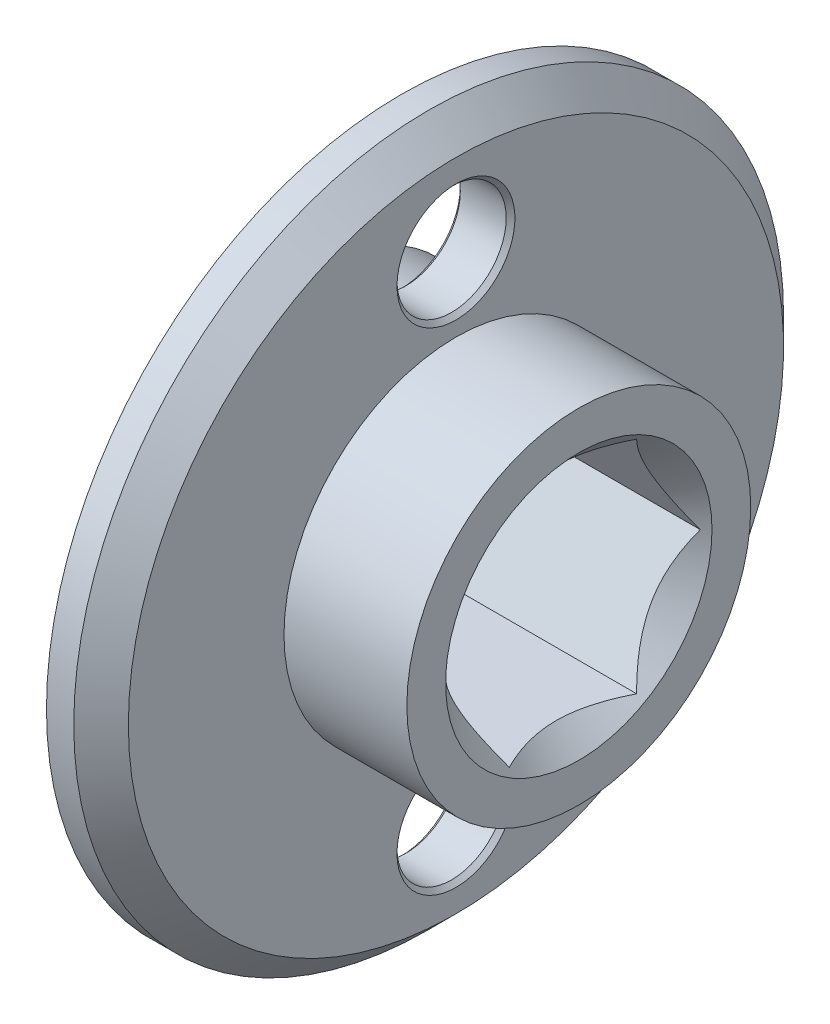
ISO-10303-21;
HEADER;
FILE_DESCRIPTION(('STEP AP214'),'2;1');
FILE_NAME('part.step','',(''),(''),'','','');
FILE_SCHEMA(('AUTOMOTIVE_DESIGN { 1 0 10303 214 1 1 1 1 }'));
ENDSEC;
DATA;
#1=APPLICATION_CONTEXT('core data for automotive mechanical design processes');
#2=APPLICATION_PROTOCOL_DEFINITION('international standard','automotive_design',2000,#1);
#3=PRODUCT_CONTEXT('',#1,'mechanical');
#4=PRODUCT('Part','Part','',(#3));
#5=PRODUCT_RELATED_PRODUCT_CATEGORY('part','',(#4));
#6=PRODUCT_DEFINITION_FORMATION('','',#4);
#7=PRODUCT_DEFINITION_CONTEXT('part definition',#1,'design');
#8=PRODUCT_DEFINITION('design','',#6,#7);
#9=PRODUCT_DEFINITION_SHAPE('','',#8);
#10=(LENGTH_UNIT() NAMED_UNIT(*) SI_UNIT(.MILLI.,.METRE.));
#11=(NAMED_UNIT(*) PLANE_ANGLE_UNIT() SI_UNIT($,.RADIAN.));
#12=(NAMED_UNIT(*) SI_UNIT($,.STERADIAN.) SOLID_ANGLE_UNIT());
#13=UNCERTAINTY_MEASURE_WITH_UNIT(LENGTH_MEASURE(1.E-05),#10,'distance_accuracy_value','');
#14=(GEOMETRIC_REPRESENTATION_CONTEXT(3) GLOBAL_UNCERTAINTY_ASSIGNED_CONTEXT((#13)) GLOBAL_UNIT_ASSIGNED_CONTEXT((#10,
#11,#12)) REPRESENTATION_CONTEXT('',''));
#15=CARTESIAN_POINT('',(0.,0.,0.));
#16=DIRECTION('',(0.,0.,1.));
#17=DIRECTION('',(1.,0.,0.));
#18=AXIS2_PLACEMENT_3D('',#15,#16,#17);
#19=CARTESIAN_POINT('',(7.6835,14.2875,0.));
#20=DIRECTION('',(1.,0.,0.));
#21=DIRECTION('',(0.,0.,-1.));
#22=AXIS2_PLACEMENT_3D('',#19,#20,#21);
#23=CONICAL_SURFACE('',#22,3.175,0.785398163397441);
#24=CARTESIAN_POINT('',(7.6835,14.2875,0.));
#25=DIRECTION('',(1.,0.,0.));
#26=DIRECTION('',(0.,0.,1.));
#27=AXIS2_PLACEMENT_3D('',#24,#25,#26);
#28=CIRCLE('',#27,3.175);
#29=CARTESIAN_POINT('',(7.6835,14.2875,3.175));
#30=VERTEX_POINT('',#29);
#31=EDGE_CURVE('E30',#30,#30,#28,.T.);
#32=ORIENTED_EDGE('',*,*,#31,.F.);
#33=EDGE_LOOP('',(#32));
#34=FACE_BOUND('',#33,.T.);
#35=CARTESIAN_POINT('',(7.9375,14.2875,0.));
#36=DIRECTION('',(-1.,0.,0.));
#37=DIRECTION('',(0.,0.,1.));
#38=AXIS2_PLACEMENT_3D('',#35,#36,#37);
#39=CIRCLE('',#38,3.429);
#40=CARTESIAN_POINT('',(7.9375,14.2875,3.429));
#41=VERTEX_POINT('',#40);
#42=EDGE_CURVE('E138',#41,#41,#39,.T.);
#43=ORIENTED_EDGE('',*,*,#42,.F.);
#44=EDGE_LOOP('',(#43));
#45=FACE_BOUND('',#44,.T.);
#46=ADVANCED_FACE('F16',(#34,#45),#23,.F.);
#47=CARTESIAN_POINT('',(4.7625,14.2875,0.));
#48=DIRECTION('',(-1.,0.,0.));
#49=DIRECTION('',(0.,0.,1.));
#50=AXIS2_PLACEMENT_3D('',#47,#48,#49);
#51=CONICAL_SURFACE('',#50,3.429,0.785398163397457);
#52=CARTESIAN_POINT('',(5.0165,14.2875,0.));
#53=DIRECTION('',(-1.,0.,0.));
#54=DIRECTION('',(0.,0.,-1.));
#55=AXIS2_PLACEMENT_3D('',#52,#53,#54);
#56=CIRCLE('',#55,3.175);
#57=CARTESIAN_POINT('',(5.0165,14.2875,-3.175));
#58=VERTEX_POINT('',#57);
#59=EDGE_CURVE('E11',#58,#58,#56,.T.);
#60=ORIENTED_EDGE('',*,*,#59,.F.);
#61=EDGE_LOOP('',(#60));
#62=FACE_BOUND('',#61,.T.);
#63=CARTESIAN_POINT('',(4.7625,14.2875,0.));
#64=DIRECTION('',(1.,0.,0.));
#65=DIRECTION('',(0.,0.,-1.));
#66=AXIS2_PLACEMENT_3D('',#63,#64,#65);
#67=CIRCLE('',#66,3.429);
#68=CARTESIAN_POINT('',(4.7625,14.2875,-3.429));
#69=VERTEX_POINT('',#68);
#70=EDGE_CURVE('E496',#69,#69,#67,.T.);
#71=ORIENTED_EDGE('',*,*,#70,.F.);
#72=EDGE_LOOP('',(#71));
#73=FACE_BOUND('',#72,.T.);
#74=ADVANCED_FACE('F691',(#62,#73),#51,.F.);
#75=CARTESIAN_POINT('',(7.6835,-14.2875,0.));
#76=DIRECTION('',(1.,0.,0.));
#77=DIRECTION('',(0.,0.,-1.));
#78=AXIS2_PLACEMENT_3D('',#75,#76,#77);
#79=CONICAL_SURFACE('',#78,3.175,0.785398163397441);
#80=CARTESIAN_POINT('',(7.6835,-14.2875,0.));
#81=DIRECTION('',(1.,0.,0.));
#82=DIRECTION('',(0.,0.,1.));
#83=AXIS2_PLACEMENT_3D('',#80,#81,#82);
#84=CIRCLE('',#83,3.175);
#85=CARTESIAN_POINT('',(7.6835,-14.2875,3.175));
#86=VERTEX_POINT('',#85);
#87=EDGE_CURVE('E137',#86,#86,#84,.T.);
#88=ORIENTED_EDGE('',*,*,#87,.F.);
#89=EDGE_LOOP('',(#88));
#90=FACE_BOUND('',#89,.T.);
#91=CARTESIAN_POINT('',(7.9375,-14.2875,0.));
#92=DIRECTION('',(-1.,0.,0.));
#93=DIRECTION('',(0.,0.,1.));
#94=AXIS2_PLACEMENT_3D('',#91,#92,#93);
#95=CIRCLE('',#94,3.429);
#96=CARTESIAN_POINT('',(7.9375,-14.2875,3.429));
#97=VERTEX_POINT('',#96);
#98=EDGE_CURVE('E148',#97,#97,#95,.T.);
#99=ORIENTED_EDGE('',*,*,#98,.F.);
#100=EDGE_LOOP('',(#99));
#101=FACE_BOUND('',#100,.T.);
#102=ADVANCED_FACE('F695',(#90,#101),#79,.F.);
#103=CARTESIAN_POINT('',(4.7625,-14.2875,0.));
#104=DIRECTION('',(-1.,0.,0.));
#105=DIRECTION('',(0.,0.,1.));
#106=AXIS2_PLACEMENT_3D('',#103,#104,#105);
#107=CONICAL_SURFACE('',#106,3.429,0.785398163397457);
#108=CARTESIAN_POINT('',(5.0165,-14.2875,0.));
#109=DIRECTION('',(-1.,0.,0.));
#110=DIRECTION('',(0.,0.,-1.));
#111=AXIS2_PLACEMENT_3D('',#108,#109,#110);
#112=CIRCLE('',#111,3.175);
#113=CARTESIAN_POINT('',(5.0165,-14.2875,-3.175));
#114=VERTEX_POINT('',#113);
#115=EDGE_CURVE('E145',#114,#114,#112,.T.);
#116=ORIENTED_EDGE('',*,*,#115,.F.);
#117=EDGE_LOOP('',(#116));
#118=FACE_BOUND('',#117,.T.);
#119=CARTESIAN_POINT('',(4.7625,-14.2875,0.));
#120=DIRECTION('',(1.,0.,0.));
#121=DIRECTION('',(0.,0.,-1.));
#122=AXIS2_PLACEMENT_3D('',#119,#120,#121);
#123=CIRCLE('',#122,3.429);
#124=CARTESIAN_POINT('',(4.7625,-14.2875,-3.429));
#125=VERTEX_POINT('',#124);
#126=EDGE_CURVE('E493',#125,#125,#123,.T.);
#127=ORIENTED_EDGE('',*,*,#126,.F.);
#128=EDGE_LOOP('',(#127));
#129=FACE_BOUND('',#128,.T.);
#130=ADVANCED_FACE('F177',(#118,#129),#107,.F.);
#131=CARTESIAN_POINT('',(0.,14.2875,0.));
#132=DIRECTION('',(1.,0.,0.));
#133=DIRECTION('',(0.,0.,-1.));
#134=AXIS2_PLACEMENT_3D('',#131,#132,#133);
#135=CYLINDRICAL_SURFACE('',#134,3.175);
#136=ORIENTED_EDGE('',*,*,#59,.T.);
#137=EDGE_LOOP('',(#136));
#138=FACE_BOUND('',#137,.T.);
#139=ORIENTED_EDGE('',*,*,#31,.T.);
#140=EDGE_LOOP('',(#139));
#141=FACE_BOUND('',#140,.T.);
#142=ADVANCED_FACE('F715',(#138,#141),#135,.F.);
#143=CARTESIAN_POINT('',(0.,-14.2875,0.));
#144=DIRECTION('',(1.,0.,0.));
#145=DIRECTION('',(0.,0.,-1.));
#146=AXIS2_PLACEMENT_3D('',#143,#144,#145);
#147=CYLINDRICAL_SURFACE('',#146,3.175);
#148=ORIENTED_EDGE('',*,*,#115,.T.);
#149=EDGE_LOOP('',(#148));
#150=FACE_BOUND('',#149,.T.);
#151=ORIENTED_EDGE('',*,*,#87,.T.);
#152=EDGE_LOOP('',(#151));
#153=FACE_BOUND('',#152,.T.);
#154=ADVANCED_FACE('F214',(#150,#153),#147,.F.);
#155=CARTESIAN_POINT('',(15.08125,0.,0.));
#156=DIRECTION('',(1.,0.,0.));
#157=DIRECTION('',(0.,0.,-1.));
#158=AXIS2_PLACEMENT_3D('',#155,#156,#157);
#159=CONICAL_SURFACE('',#158,7.747,0.78539816339745);
#160=CARTESIAN_POINT('',(14.7399219028953,-6.4135,3.70283595144766));
#161=CARTESIAN_POINT('',(14.267877589409,-6.4135,2.75874732447493));
#162=CARTESIAN_POINT('',(14.0247721713693,-6.4135,1.90528335834433));
#163=CARTESIAN_POINT('',(13.7482566673468,-6.4135,0.93452745885578));
#164=CARTESIAN_POINT('',(13.7477506697308,-6.4135,0.00293097886281497));
#165=CARTESIAN_POINT('',(13.7472437163592,-6.4135,-0.93042515082771));
#166=CARTESIAN_POINT('',(14.0247383537025,-6.4135,-1.90516460208269));
#167=CARTESIAN_POINT('',(14.2675612650675,-6.4135,-2.75811467579258));
#168=CARTESIAN_POINT('',(14.7399219028953,-6.4135,-3.70283595144767));
#169=B_SPLINE_CURVE_WITH_KNOTS('',2,(#160,#161,#162,#163,#164,#165,#166,#167,#168),
.UNSPECIFIED.,.F.,.F.,(3,2,2,2,3),(0.,0.25,0.5,0.75,1.),.UNSPECIFIED.);
#170=CARTESIAN_POINT('',(14.7399219028953,-6.4135,3.70283595144766));
#171=VERTEX_POINT('',#170);
#172=CARTESIAN_POINT('',(14.7399219028953,-6.4135,-3.70283595144767));
#173=VERTEX_POINT('',#172);
#174=EDGE_CURVE('E286',#171,#173,#169,.T.);
#175=ORIENTED_EDGE('',*,*,#174,.F.);
#176=CARTESIAN_POINT('',(14.7399219028953,0.,7.40567190289533));
#177=CARTESIAN_POINT('',(14.2717959466866,-0.810817940495197,6.93754594668665));
#178=CARTESIAN_POINT('',(14.0288914440783,-1.5442424478132,6.51410310995633));
#179=CARTESIAN_POINT('',(13.7498291833271,-2.38684148943134,6.02762832645918));
#180=CARTESIAN_POINT('',(13.7477644875398,-3.19494432713848,5.56106993557606));
#181=CARTESIAN_POINT('',(13.7456983261538,-4.00362078661616,5.09418036400931));
#182=CARTESIAN_POINT('',(14.0218286308293,-4.84779974639502,4.60679341433676));
#183=CARTESIAN_POINT('',(14.2647688500163,-5.59051077104238,4.17798900432651));
#184=CARTESIAN_POINT('',(14.7399219028953,-6.4135,3.70283595144766));
#185=B_SPLINE_CURVE_WITH_KNOTS('',2,(#176,#177,#178,#179,#180,#181,#182,#183,#184),
.UNSPECIFIED.,.F.,.F.,(3,2,2,2,3),(0.,0.25,0.5,0.75,1.),.UNSPECIFIED.);
#186=CARTESIAN_POINT('',(14.7399219028953,0.,7.40567190289533));
#187=VERTEX_POINT('',#186);
#188=EDGE_CURVE('E345',#187,#171,#185,.T.);
#189=ORIENTED_EDGE('',*,*,#188,.F.);
#190=CARTESIAN_POINT('',(14.7399219028953,6.4135,3.70283595144766));
#191=CARTESIAN_POINT('',(14.2717959466885,5.60268205950795,4.17096190765453));
#192=CARTESIAN_POINT('',(14.0288914440783,4.8692575521868,4.59440474438666));
#193=CARTESIAN_POINT('',(13.7498291833286,4.0266585105759,5.08087952787964));
#194=CARTESIAN_POINT('',(13.7477644875397,3.21855567286153,5.54743791876693));
#195=CARTESIAN_POINT('',(13.7456983261523,2.40987921338704,6.01432749033184));
#196=CARTESIAN_POINT('',(14.0218286308293,1.56570025360498,6.50171444000623));
#197=CARTESIAN_POINT('',(14.2647688500172,0.822989228955982,6.93051885001743));
#198=CARTESIAN_POINT('',(14.7399219028953,0.,7.40567190289533));
#199=B_SPLINE_CURVE_WITH_KNOTS('',2,(#190,#191,#192,#193,#194,#195,#196,#197,#198),
.UNSPECIFIED.,.F.,.F.,(3,2,2,2,3),(0.,0.25,0.5,0.75,1.),.UNSPECIFIED.);
#200=CARTESIAN_POINT('',(14.7399219028953,6.4135,3.70283595144766));
#201=VERTEX_POINT('',#200);
#202=EDGE_CURVE('E373',#201,#187,#199,.T.);
#203=ORIENTED_EDGE('',*,*,#202,.F.);
#204=CARTESIAN_POINT('',(14.7399219028953,6.4135,-3.70283595144766));
#205=CARTESIAN_POINT('',(14.2678775894089,6.4135,-2.75874732447478));
#206=CARTESIAN_POINT('',(14.0247721713693,6.4135,-1.90528335834433));
#207=CARTESIAN_POINT('',(13.7482566673468,6.4135,-0.93452745885557));
#208=CARTESIAN_POINT('',(13.7477506697308,6.4135,-0.00293097886281974));
#209=CARTESIAN_POINT('',(13.7472437163592,6.4135,0.930425150839115));
#210=CARTESIAN_POINT('',(14.0247383537025,6.4135,1.90516460208269));
#211=CARTESIAN_POINT('',(14.2675612650742,6.4135,2.75811467580593));
#212=CARTESIAN_POINT('',(14.7399219028953,6.4135,3.70283595144766));
#213=B_SPLINE_CURVE_WITH_KNOTS('',2,(#204,#205,#206,#207,#208,#209,#210,#211,#212),
.UNSPECIFIED.,.F.,.F.,(3,2,2,2,3),(0.,0.25,0.5,0.75,1.),.UNSPECIFIED.);
#214=CARTESIAN_POINT('',(14.7399219028953,6.4135,-3.70283595144766));
#215=VERTEX_POINT('',#214);
#216=EDGE_CURVE('E427',#215,#201,#213,.T.);
#217=ORIENTED_EDGE('',*,*,#216,.F.);
#218=CARTESIAN_POINT('',(14.7399219028953,0.,-7.40567190289533));
#219=CARTESIAN_POINT('',(14.2717959466941,0.810817940482282,-6.93754594669411));
#220=CARTESIAN_POINT('',(14.0288914440783,1.5442424478132,-6.51410310995633));
#221=CARTESIAN_POINT('',(13.7498291833286,2.38684148941569,-6.02762832646821));
#222=CARTESIAN_POINT('',(13.7477644875398,3.19494432713847,-5.56106993557606));
#223=CARTESIAN_POINT('',(13.7456983261523,4.00362078660251,-5.09418036401719));
#224=CARTESIAN_POINT('',(14.0218286308293,4.84779974639502,-4.60679341433676));
#225=CARTESIAN_POINT('',(14.2647688500102,5.59051077103182,-4.1779890043326));
#226=CARTESIAN_POINT('',(14.7399219028953,6.4135,-3.70283595144766));
#227=B_SPLINE_CURVE_WITH_KNOTS('',2,(#218,#219,#220,#221,#222,#223,#224,#225,#226),
.UNSPECIFIED.,.F.,.F.,(3,2,2,2,3),(0.,0.25,0.5,0.75,1.),.UNSPECIFIED.);
#228=CARTESIAN_POINT('',(14.7399219028953,0.,-7.40567190289533));
#229=VERTEX_POINT('',#228);
#230=EDGE_CURVE('E198',#229,#215,#227,.T.);
#231=ORIENTED_EDGE('',*,*,#230,.F.);
#232=CARTESIAN_POINT('',(14.7399219028953,-6.4135,-3.70283595144767));
#233=CARTESIAN_POINT('',(14.2717959466965,-5.60268205952184,-4.17096190764651));
#234=CARTESIAN_POINT('',(14.0288914440783,-4.8692575521868,-4.59440474438667));
#235=CARTESIAN_POINT('',(13.7498291833271,-4.02665851058334,-5.08087952787534));
#236=CARTESIAN_POINT('',(13.7477644875398,-3.21855567286152,-5.54743791876694));
#237=CARTESIAN_POINT('',(13.7456983261538,-2.40987921339921,-6.01432749032482));
#238=CARTESIAN_POINT('',(14.0218286308293,-1.56570025360497,-6.50171444000624));
#239=CARTESIAN_POINT('',(14.264768850006,-0.822989228975442,-6.9305188500062));
#240=CARTESIAN_POINT('',(14.7399219028953,0.,-7.40567190289534));
#241=B_SPLINE_CURVE_WITH_KNOTS('',2,(#232,#233,#234,#235,#236,#237,#238,#239,#240),
.UNSPECIFIED.,.F.,.F.,(3,2,2,2,3),(0.,0.25,0.5,0.75,1.),.UNSPECIFIED.);
#242=EDGE_CURVE('E277',#173,#229,#241,.T.);
#243=ORIENTED_EDGE('',*,*,#242,.F.);
#244=EDGE_LOOP('',(#175,#189,#203,#217,#231,#243));
#245=FACE_BOUND('',#244,.T.);
#246=CARTESIAN_POINT('',(15.08125,0.,0.));
#247=DIRECTION('',(1.,0.,0.));
#248=DIRECTION('',(0.,0.,-1.));
#249=AXIS2_PLACEMENT_3D('',#246,#247,#248);
#250=CIRCLE('',#249,7.747);
#251=CARTESIAN_POINT('',(15.08125,0.,-7.747));
#252=VERTEX_POINT('',#251);
#253=EDGE_CURVE('E133',#252,#252,#250,.T.);
#254=ORIENTED_EDGE('',*,*,#253,.T.);
#255=EDGE_LOOP('',(#254));
#256=FACE_BOUND('',#255,.T.);
#257=ADVANCED_FACE('F134',(#245,#256),#159,.F.);
#258=CARTESIAN_POINT('',(0.,0.,0.));
#259=DIRECTION('',(-1.,0.,0.));
#260=DIRECTION('',(0.,0.,1.));
#261=AXIS2_PLACEMENT_3D('',#258,#259,#260);
#262=CONICAL_SURFACE('',#261,7.747,0.78539816339745);
#263=CARTESIAN_POINT('',(0.34132809710467,6.4135,-3.70283595144766));
#264=CARTESIAN_POINT('',(0.809454053307812,5.60268205951439,-4.17096190765081));
#265=CARTESIAN_POINT('',(1.05235855592169,4.8692575521868,-4.59440474438667));
#266=CARTESIAN_POINT('',(1.33142081667347,4.02665851057518,-5.08087952788005));
#267=CARTESIAN_POINT('',(1.33348551246024,3.21855567286152,-5.54743791876693));
#268=CARTESIAN_POINT('',(1.33555167384567,2.40987921338774,-6.01432749033143));
#269=CARTESIAN_POINT('',(1.05942136917073,1.56570025360498,-6.50171444000623));
#270=CARTESIAN_POINT('',(0.816481149987474,0.822989228964093,-6.93051885001275));
#271=CARTESIAN_POINT('',(0.34132809710467,0.,-7.40567190289533));
#272=B_SPLINE_CURVE_WITH_KNOTS('',2,(#263,#264,#265,#266,#267,#268,#269,#270,#271),
.UNSPECIFIED.,.F.,.F.,(3,2,2,2,3),(0.,0.25,0.5,0.75,1.),.UNSPECIFIED.);
#273=CARTESIAN_POINT('',(0.34132809710467,6.4135,-3.70283595144766));
#274=VERTEX_POINT('',#273);
#275=CARTESIAN_POINT('',(0.34132809710467,0.,-7.40567190289533));
#276=VERTEX_POINT('',#275);
#277=EDGE_CURVE('E158',#274,#276,#272,.T.);
#278=ORIENTED_EDGE('',*,*,#277,.F.);
#279=CARTESIAN_POINT('',(0.341328097104669,6.4135,3.70283595144766));
#280=CARTESIAN_POINT('',(0.812638444111322,6.4135,2.76021525743436));
#281=CARTESIAN_POINT('',(1.05570643551976,6.4135,1.90799038678256));
#282=CARTESIAN_POINT('',(1.33304363001701,6.4135,0.935613673016906));
#283=CARTESIAN_POINT('',(1.33349948039145,6.4135,0.00258166982846503));
#284=CARTESIAN_POINT('',(1.33395603379455,6.4135,-0.931889288497405));
#285=CARTESIAN_POINT('',(1.05573043374802,6.4135,-1.90790622365198));
#286=CARTESIAN_POINT('',(0.812942821532926,6.4135,-2.75960650259124));
#287=CARTESIAN_POINT('',(0.34132809710467,6.4135,-3.70283595144766));
#288=B_SPLINE_CURVE_WITH_KNOTS('',2,(#279,#280,#281,#282,#283,#284,#285,#286,#287),
.UNSPECIFIED.,.F.,.F.,(3,2,2,2,3),(0.,0.25,0.5,0.75,1.),.UNSPECIFIED.);
#289=CARTESIAN_POINT('',(0.341328097104669,6.4135,3.70283595144766));
#290=VERTEX_POINT('',#289);
#291=EDGE_CURVE('E418',#290,#274,#288,.T.);
#292=ORIENTED_EDGE('',*,*,#291,.F.);
#293=CARTESIAN_POINT('',(0.341328097104671,0.,7.40567190289533));
#294=CARTESIAN_POINT('',(0.80945405330752,0.810817940485097,6.93754594669248));
#295=CARTESIAN_POINT('',(1.05235855592169,1.54424244781319,6.51410310995633));
#296=CARTESIAN_POINT('',(1.33142081667366,2.38684148942493,6.02762832646288));
#297=CARTESIAN_POINT('',(1.33348551246024,3.19494432713847,5.56106993557606));
#298=CARTESIAN_POINT('',(1.33555167384548,4.00362078661281,5.09418036401124));
#299=CARTESIAN_POINT('',(1.05942136917073,4.84779974639502,4.60679341433677));
#300=CARTESIAN_POINT('',(0.816481149987482,5.59051077103589,4.17798900433025));
#301=CARTESIAN_POINT('',(0.341328097104669,6.4135,3.70283595144766));
#302=B_SPLINE_CURVE_WITH_KNOTS('',2,(#293,#294,#295,#296,#297,#298,#299,#300,#301),
.UNSPECIFIED.,.F.,.F.,(3,2,2,2,3),(0.,0.25,0.5,0.75,1.),.UNSPECIFIED.);
#303=CARTESIAN_POINT('',(0.341328097104671,0.,7.40567190289533));
#304=VERTEX_POINT('',#303);
#305=EDGE_CURVE('E380',#304,#290,#302,.T.);
#306=ORIENTED_EDGE('',*,*,#305,.F.);
#307=CARTESIAN_POINT('',(0.341328097104671,-6.4135,3.70283595144766));
#308=CARTESIAN_POINT('',(0.80945405330968,-5.60268205951116,4.17096190765267));
#309=CARTESIAN_POINT('',(1.05235855592169,-4.8692575521868,4.59440474438667));
#310=CARTESIAN_POINT('',(1.33142081667348,-4.0266585105724,5.08087952788166));
#311=CARTESIAN_POINT('',(1.33348551246024,-3.21855567286152,5.54743791876693));
#312=CARTESIAN_POINT('',(1.33555167384566,-2.40987921338906,6.01432749033067));
#313=CARTESIAN_POINT('',(1.05942136917073,-1.56570025360498,6.50171444000623));
#314=CARTESIAN_POINT('',(0.816481149988356,-0.822989228965626,6.93051885001186));
#315=CARTESIAN_POINT('',(0.341328097104671,0.,7.40567190289533));
#316=B_SPLINE_CURVE_WITH_KNOTS('',2,(#307,#308,#309,#310,#311,#312,#313,#314,#315),
.UNSPECIFIED.,.F.,.F.,(3,2,2,2,3),(0.,0.25,0.5,0.75,1.),.UNSPECIFIED.);
#317=CARTESIAN_POINT('',(0.341328097104671,-6.4135,3.70283595144766));
#318=VERTEX_POINT('',#317);
#319=EDGE_CURVE('E337',#318,#304,#316,.T.);
#320=ORIENTED_EDGE('',*,*,#319,.F.);
#321=CARTESIAN_POINT('',(0.341328097104669,-6.4135,-3.70283595144767));
#322=CARTESIAN_POINT('',(0.81263844411173,-6.4135,-2.76021525743354));
#323=CARTESIAN_POINT('',(1.05570643551976,-6.4135,-1.90799038678256));
#324=CARTESIAN_POINT('',(1.33304363001701,-6.4135,-0.9356136730162));
#325=CARTESIAN_POINT('',(1.33349948039145,-6.4135,-0.00258166982846503));
#326=CARTESIAN_POINT('',(1.33395603379454,-6.4135,0.93188928849608));
#327=CARTESIAN_POINT('',(1.05573043374802,-6.4135,1.90790622365197));
#328=CARTESIAN_POINT('',(0.812942821533693,-6.4135,2.7596065025897));
#329=CARTESIAN_POINT('',(0.341328097104671,-6.4135,3.70283595144766));
#330=B_SPLINE_CURVE_WITH_KNOTS('',2,(#321,#322,#323,#324,#325,#326,#327,#328,#329),
.UNSPECIFIED.,.F.,.F.,(3,2,2,2,3),(0.,0.25,0.5,0.75,1.),.UNSPECIFIED.);
#331=CARTESIAN_POINT('',(0.341328097104669,-6.4135,-3.70283595144767));
#332=VERTEX_POINT('',#331);
#333=EDGE_CURVE('E334',#332,#318,#330,.T.);
#334=ORIENTED_EDGE('',*,*,#333,.F.);
#335=CARTESIAN_POINT('',(0.341328097104671,0.,-7.40567190289534));
#336=CARTESIAN_POINT('',(0.809454053309195,-0.810817940487997,-6.93754594669081));
#337=CARTESIAN_POINT('',(1.05235855592169,-1.54424244781319,-6.51410310995634));
#338=CARTESIAN_POINT('',(1.33142081667329,-2.3868414894263,-6.02762832646209));
#339=CARTESIAN_POINT('',(1.33348551246024,-3.19494432713848,-5.56106993557607));
#340=CARTESIAN_POINT('',(1.33555167384585,-4.00362078660932,-5.09418036401326));
#341=CARTESIAN_POINT('',(1.05942136917073,-4.84779974639502,-4.60679341433677));
#342=CARTESIAN_POINT('',(0.816481149989052,-5.59051077103317,-4.17798900433183));
#343=CARTESIAN_POINT('',(0.341328097104669,-6.4135,-3.70283595144767));
#344=B_SPLINE_CURVE_WITH_KNOTS('',2,(#335,#336,#337,#338,#339,#340,#341,#342,#343),
.UNSPECIFIED.,.F.,.F.,(3,2,2,2,3),(0.,0.25,0.5,0.75,1.),.UNSPECIFIED.);
#345=EDGE_CURVE('E255',#276,#332,#344,.T.);
#346=ORIENTED_EDGE('',*,*,#345,.F.);
#347=EDGE_LOOP('',(#278,#292,#306,#320,#334,#346));
#348=FACE_BOUND('',#347,.T.);
#349=CARTESIAN_POINT('',(0.,0.,0.));
#350=DIRECTION('',(-1.,0.,0.));
#351=DIRECTION('',(0.,0.,1.));
#352=AXIS2_PLACEMENT_3D('',#349,#350,#351);
#353=CIRCLE('',#352,7.747);
#354=CARTESIAN_POINT('',(0.,0.,7.747));
#355=VERTEX_POINT('',#354);
#356=EDGE_CURVE('E526',#355,#355,#353,.T.);
#357=ORIENTED_EDGE('',*,*,#356,.T.);
#358=EDGE_LOOP('',(#357));
#359=FACE_BOUND('',#358,.T.);
#360=ADVANCED_FACE('F213',(#348,#359),#262,.F.);
#361=CARTESIAN_POINT('',(15.08125,0.,0.));
#362=DIRECTION('',(1.,0.,0.));
#363=DIRECTION('',(0.,1.,0.));
#364=AXIS2_PLACEMENT_3D('',#361,#362,#363);
#365=PLANE('',#364);
#366=ORIENTED_EDGE('',*,*,#253,.F.);
#367=EDGE_LOOP('',(#366));
#368=FACE_BOUND('',#367,.T.);
#369=CARTESIAN_POINT('',(15.08125,0.,0.));
#370=DIRECTION('',(1.,0.,0.));
#371=DIRECTION('',(0.,0.,-1.));
#372=AXIS2_PLACEMENT_3D('',#369,#370,#371);
#373=CIRCLE('',#372,10.);
#374=CARTESIAN_POINT('',(15.08125,0.,-10.));
#375=VERTEX_POINT('',#374);
#376=EDGE_CURVE('E300',#375,#375,#373,.T.);
#377=ORIENTED_EDGE('',*,*,#376,.T.);
#378=EDGE_LOOP('',(#377));
#379=FACE_BOUND('',#378,.T.);
#380=ADVANCED_FACE('F398',(#368,#379),#365,.T.);
#381=CARTESIAN_POINT('',(6.35,0.,0.));
#382=DIRECTION('',(-1.,0.,0.));
#383=DIRECTION('',(0.,0.,1.));
#384=AXIS2_PLACEMENT_3D('',#381,#382,#383);
#385=CONICAL_SURFACE('',#384,20.6375,0.78539816339745);
#386=CARTESIAN_POINT('',(7.9375,0.,0.));
#387=DIRECTION('',(1.,0.,0.));
#388=DIRECTION('',(0.,0.,1.));
#389=AXIS2_PLACEMENT_3D('',#386,#387,#388);
#390=CIRCLE('',#389,19.05);
#391=CARTESIAN_POINT('',(7.9375,0.,19.05));
#392=VERTEX_POINT('',#391);
#393=EDGE_CURVE('E603',#392,#392,#390,.T.);
#394=ORIENTED_EDGE('',*,*,#393,.F.);
#395=EDGE_LOOP('',(#394));
#396=FACE_BOUND('',#395,.T.);
#397=CARTESIAN_POINT('',(6.35,0.,0.));
#398=DIRECTION('',(-1.,0.,0.));
#399=DIRECTION('',(0.,0.,1.));
#400=AXIS2_PLACEMENT_3D('',#397,#398,#399);
#401=CIRCLE('',#400,20.6375);
#402=CARTESIAN_POINT('',(6.35,0.,20.6375));
#403=VERTEX_POINT('',#402);
#404=EDGE_CURVE('E151',#403,#403,#401,.T.);
#405=ORIENTED_EDGE('',*,*,#404,.F.);
#406=EDGE_LOOP('',(#405));
#407=FACE_BOUND('',#406,.T.);
#408=ADVANCED_FACE('F703',(#396,#407),#385,.T.);
#409=CARTESIAN_POINT('',(7.9375,20.6375,0.));
#410=DIRECTION('',(-1.,0.,0.));
#411=DIRECTION('',(0.,0.,1.));
#412=AXIS2_PLACEMENT_3D('',#409,#410,#411);
#413=PLANE('',#412);
#414=CARTESIAN_POINT('',(7.9375,0.,0.));
#415=DIRECTION('',(-1.,0.,0.));
#416=DIRECTION('',(0.,0.,1.));
#417=AXIS2_PLACEMENT_3D('',#414,#415,#416);
#418=CIRCLE('',#417,10.);
#419=CARTESIAN_POINT('',(7.9375,0.,10.));
#420=VERTEX_POINT('',#419);
#421=EDGE_CURVE('E294',#420,#420,#418,.T.);
#422=ORIENTED_EDGE('',*,*,#421,.T.);
#423=EDGE_LOOP('',(#422));
#424=FACE_BOUND('',#423,.T.);
#425=ORIENTED_EDGE('',*,*,#42,.T.);
#426=EDGE_LOOP('',(#425));
#427=FACE_BOUND('',#426,.T.);
#428=ORIENTED_EDGE('',*,*,#98,.T.);
#429=EDGE_LOOP('',(#428));
#430=FACE_BOUND('',#429,.T.);
#431=ORIENTED_EDGE('',*,*,#393,.T.);
#432=EDGE_LOOP('',(#431));
#433=FACE_BOUND('',#432,.T.);
#434=ADVANCED_FACE('F179',(#424,#427,#430,#433),#413,.F.);
#435=CARTESIAN_POINT('',(0.,0.,0.));
#436=DIRECTION('',(-1.,0.,0.));
#437=DIRECTION('',(0.,0.,1.));
#438=AXIS2_PLACEMENT_3D('',#435,#436,#437);
#439=CYLINDRICAL_SURFACE('',#438,20.6375);
#440=ORIENTED_EDGE('',*,*,#404,.T.);
#441=EDGE_LOOP('',(#440));
#442=FACE_BOUND('',#441,.T.);
#443=CARTESIAN_POINT('',(4.7625,0.,0.));
#444=DIRECTION('',(-1.,0.,0.));
#445=DIRECTION('',(0.,0.,1.));
#446=AXIS2_PLACEMENT_3D('',#443,#444,#445);
#447=CIRCLE('',#446,20.6375);
#448=CARTESIAN_POINT('',(4.7625,0.,20.6375));
#449=VERTEX_POINT('',#448);
#450=EDGE_CURVE('E497',#449,#449,#447,.T.);
#451=ORIENTED_EDGE('',*,*,#450,.F.);
#452=EDGE_LOOP('',(#451));
#453=FACE_BOUND('',#452,.T.);
#454=ADVANCED_FACE('F728',(#442,#453),#439,.T.);
#455=CARTESIAN_POINT('',(4.7625,9.525,0.));
#456=DIRECTION('',(1.,0.,0.));
#457=DIRECTION('',(0.,1.,0.));
#458=AXIS2_PLACEMENT_3D('',#455,#456,#457);
#459=PLANE('',#458);
#460=CARTESIAN_POINT('',(4.7625,0.,0.));
#461=DIRECTION('',(-1.,0.,0.));
#462=DIRECTION('',(0.,0.,1.));
#463=AXIS2_PLACEMENT_3D('',#460,#461,#462);
#464=CIRCLE('',#463,9.525);
#465=CARTESIAN_POINT('',(4.7625,0.,9.525));
#466=VERTEX_POINT('',#465);
#467=EDGE_CURVE('E517',#466,#466,#464,.T.);
#468=ORIENTED_EDGE('',*,*,#467,.F.);
#469=EDGE_LOOP('',(#468));
#470=FACE_BOUND('',#469,.T.);
#471=ORIENTED_EDGE('',*,*,#70,.T.);
#472=EDGE_LOOP('',(#471));
#473=FACE_BOUND('',#472,.T.);
#474=ORIENTED_EDGE('',*,*,#126,.T.);
#475=EDGE_LOOP('',(#474));
#476=FACE_BOUND('',#475,.T.);
#477=ORIENTED_EDGE('',*,*,#450,.T.);
#478=EDGE_LOOP('',(#477));
#479=FACE_BOUND('',#478,.T.);
#480=ADVANCED_FACE('F764',(#470,#473,#476,#479),#459,.F.);
#481=CARTESIAN_POINT('',(0.,0.,0.));
#482=DIRECTION('',(-1.,0.,0.));
#483=DIRECTION('',(0.,0.,1.));
#484=AXIS2_PLACEMENT_3D('',#481,#482,#483);
#485=CYLINDRICAL_SURFACE('',#484,9.525);
#486=CARTESIAN_POINT('',(0.,0.,0.));
#487=DIRECTION('',(-1.,0.,0.));
#488=DIRECTION('',(0.,0.,1.));
#489=AXIS2_PLACEMENT_3D('',#486,#487,#488);
#490=CIRCLE('',#489,9.525);
#491=CARTESIAN_POINT('',(0.,0.,9.525));
#492=VERTEX_POINT('',#491);
#493=EDGE_CURVE('E534',#492,#492,#490,.T.);
#494=ORIENTED_EDGE('',*,*,#493,.F.);
#495=EDGE_LOOP('',(#494));
#496=FACE_BOUND('',#495,.T.);
#497=ORIENTED_EDGE('',*,*,#467,.T.);
#498=EDGE_LOOP('',(#497));
#499=FACE_BOUND('',#498,.T.);
#500=ADVANCED_FACE('F759',(#496,#499),#485,.T.);
#501=CARTESIAN_POINT('',(0.,0.,0.));
#502=DIRECTION('',(1.,0.,0.));
#503=DIRECTION('',(0.,1.,0.));
#504=AXIS2_PLACEMENT_3D('',#501,#502,#503);
#505=PLANE('',#504);
#506=ORIENTED_EDGE('',*,*,#356,.F.);
#507=EDGE_LOOP('',(#506));
#508=FACE_BOUND('',#507,.T.);
#509=ORIENTED_EDGE('',*,*,#493,.T.);
#510=EDGE_LOOP('',(#509));
#511=FACE_BOUND('',#510,.T.);
#512=ADVANCED_FACE('F176',(#508,#511),#505,.F.);
#513=CARTESIAN_POINT('',(0.,0.,-7.40567190289533));
#514=DIRECTION('',(0.,0.5,-0.866025403784438));
#515=DIRECTION('',(-1.,0.,0.));
#516=AXIS2_PLACEMENT_3D('',#513,#514,#515);
#517=PLANE('',#516);
#518=DIRECTION('',(1.,0.,0.));
#519=VECTOR('',#518,1.);
#520=CARTESIAN_POINT('',(0.,0.,-7.40567190289533));
#521=LINE('',#520,#519);
#522=EDGE_CURVE('E289',#276,#229,#521,.T.);
#523=ORIENTED_EDGE('',*,*,#522,.T.);
#524=ORIENTED_EDGE('',*,*,#230,.T.);
#525=DIRECTION('',(1.,0.,0.));
#526=VECTOR('',#525,1.);
#527=CARTESIAN_POINT('',(0.,6.4135,-3.70283595144766));
#528=LINE('',#527,#526);
#529=EDGE_CURVE('E421',#274,#215,#528,.T.);
#530=ORIENTED_EDGE('',*,*,#529,.F.);
#531=ORIENTED_EDGE('',*,*,#277,.T.);
#532=EDGE_LOOP('',(#523,#524,#530,#531));
#533=FACE_BOUND('',#532,.T.);
#534=ADVANCED_FACE('F165',(#533),#517,.F.);
#535=CARTESIAN_POINT('',(0.,6.4135,-3.70283595144766));
#536=DIRECTION('',(0.,1.,0.));
#537=DIRECTION('',(0.,0.,-1.));
#538=AXIS2_PLACEMENT_3D('',#535,#536,#537);
#539=PLANE('',#538);
#540=ORIENTED_EDGE('',*,*,#529,.T.);
#541=ORIENTED_EDGE('',*,*,#216,.T.);
#542=DIRECTION('',(1.,0.,0.));
#543=VECTOR('',#542,1.);
#544=CARTESIAN_POINT('',(0.,6.4135,3.70283595144766));
#545=LINE('',#544,#543);
#546=EDGE_CURVE('E383',#290,#201,#545,.T.);
#547=ORIENTED_EDGE('',*,*,#546,.F.);
#548=ORIENTED_EDGE('',*,*,#291,.T.);
#549=EDGE_LOOP('',(#540,#541,#547,#548));
#550=FACE_BOUND('',#549,.T.);
#551=ADVANCED_FACE('F175',(#550),#539,.F.);
#552=CARTESIAN_POINT('',(0.,6.4135,3.70283595144766));
#553=DIRECTION('',(0.,0.5,0.866025403784439));
#554=DIRECTION('',(1.,0.,0.));
#555=AXIS2_PLACEMENT_3D('',#552,#553,#554);
#556=PLANE('',#555);
#557=ORIENTED_EDGE('',*,*,#546,.T.);
#558=ORIENTED_EDGE('',*,*,#202,.T.);
#559=DIRECTION('',(1.,0.,0.));
#560=VECTOR('',#559,1.);
#561=CARTESIAN_POINT('',(0.,0.,7.40567190289533));
#562=LINE('',#561,#560);
#563=EDGE_CURVE('E340',#304,#187,#562,.T.);
#564=ORIENTED_EDGE('',*,*,#563,.F.);
#565=ORIENTED_EDGE('',*,*,#305,.T.);
#566=EDGE_LOOP('',(#557,#558,#564,#565));
#567=FACE_BOUND('',#566,.T.);
#568=ADVANCED_FACE('F379',(#567),#556,.F.);
#569=CARTESIAN_POINT('',(0.,0.,7.40567190289533));
#570=DIRECTION('',(0.,-0.5,0.866025403784438));
#571=DIRECTION('',(-1.,0.,0.));
#572=AXIS2_PLACEMENT_3D('',#569,#570,#571);
#573=PLANE('',#572);
#574=ORIENTED_EDGE('',*,*,#563,.T.);
#575=ORIENTED_EDGE('',*,*,#188,.T.);
#576=DIRECTION('',(1.,0.,0.));
#577=VECTOR('',#576,1.);
#578=CARTESIAN_POINT('',(0.,-6.4135,3.70283595144766));
#579=LINE('',#578,#577);
#580=EDGE_CURVE('E348',#318,#171,#579,.T.);
#581=ORIENTED_EDGE('',*,*,#580,.F.);
#582=ORIENTED_EDGE('',*,*,#319,.T.);
#583=EDGE_LOOP('',(#574,#575,#581,#582));
#584=FACE_BOUND('',#583,.T.);
#585=ADVANCED_FACE('F321',(#584),#573,.F.);
#586=CARTESIAN_POINT('',(0.,-6.4135,3.70283595144766));
#587=DIRECTION('',(0.,-1.,0.));
#588=DIRECTION('',(0.,0.,-1.));
#589=AXIS2_PLACEMENT_3D('',#586,#587,#588);
#590=PLANE('',#589);
#591=ORIENTED_EDGE('',*,*,#580,.T.);
#592=ORIENTED_EDGE('',*,*,#174,.T.);
#593=DIRECTION('',(1.,0.,0.));
#594=VECTOR('',#593,1.);
#595=CARTESIAN_POINT('',(0.,-6.4135,-3.70283595144767));
#596=LINE('',#595,#594);
#597=EDGE_CURVE('E290',#332,#173,#596,.T.);
#598=ORIENTED_EDGE('',*,*,#597,.F.);
#599=ORIENTED_EDGE('',*,*,#333,.T.);
#600=EDGE_LOOP('',(#591,#592,#598,#599));
#601=FACE_BOUND('',#600,.T.);
#602=ADVANCED_FACE('F312',(#601),#590,.F.);
#603=CARTESIAN_POINT('',(0.,-6.4135,-3.70283595144767));
#604=DIRECTION('',(0.,-0.5,-0.866025403784439));
#605=DIRECTION('',(0.,-0.866025403784439,0.5));
#606=AXIS2_PLACEMENT_3D('',#603,#604,#605);
#607=PLANE('',#606);
#608=ORIENTED_EDGE('',*,*,#597,.T.);
#609=ORIENTED_EDGE('',*,*,#242,.T.);
#610=ORIENTED_EDGE('',*,*,#522,.F.);
#611=ORIENTED_EDGE('',*,*,#345,.T.);
#612=EDGE_LOOP('',(#608,#609,#610,#611));
#613=FACE_BOUND('',#612,.T.);
#614=ADVANCED_FACE('F18',(#613),#607,.F.);
#615=CARTESIAN_POINT('',(0.,0.,0.));
#616=DIRECTION('',(-1.,0.,0.));
#617=DIRECTION('',(0.,0.,1.));
#618=AXIS2_PLACEMENT_3D('',#615,#616,#617);
#619=CYLINDRICAL_SURFACE('',#618,10.);
#620=ORIENTED_EDGE('',*,*,#421,.F.);
#621=EDGE_LOOP('',(#620));
#622=FACE_BOUND('',#621,.T.);
#623=ORIENTED_EDGE('',*,*,#376,.F.);
#624=EDGE_LOOP('',(#623));
#625=FACE_BOUND('',#624,.T.);
#626=ADVANCED_FACE('F322',(#622,#625),#619,.T.);
#627=CLOSED_SHELL('',(#46,#74,#102,#130,#142,#154,#257,#360,#380,#408,#434,#454,#480,#500,#512,
#534,#551,#568,#585,#602,#614,#626));
#628=MANIFOLD_SOLID_BREP('B1',#627);
#629=ADVANCED_BREP_SHAPE_REPRESENTATION('',(#18,#628),#14);
#630=SHAPE_DEFINITION_REPRESENTATION(#9,#629);
ENDSEC;
END-ISO-10303-21;
